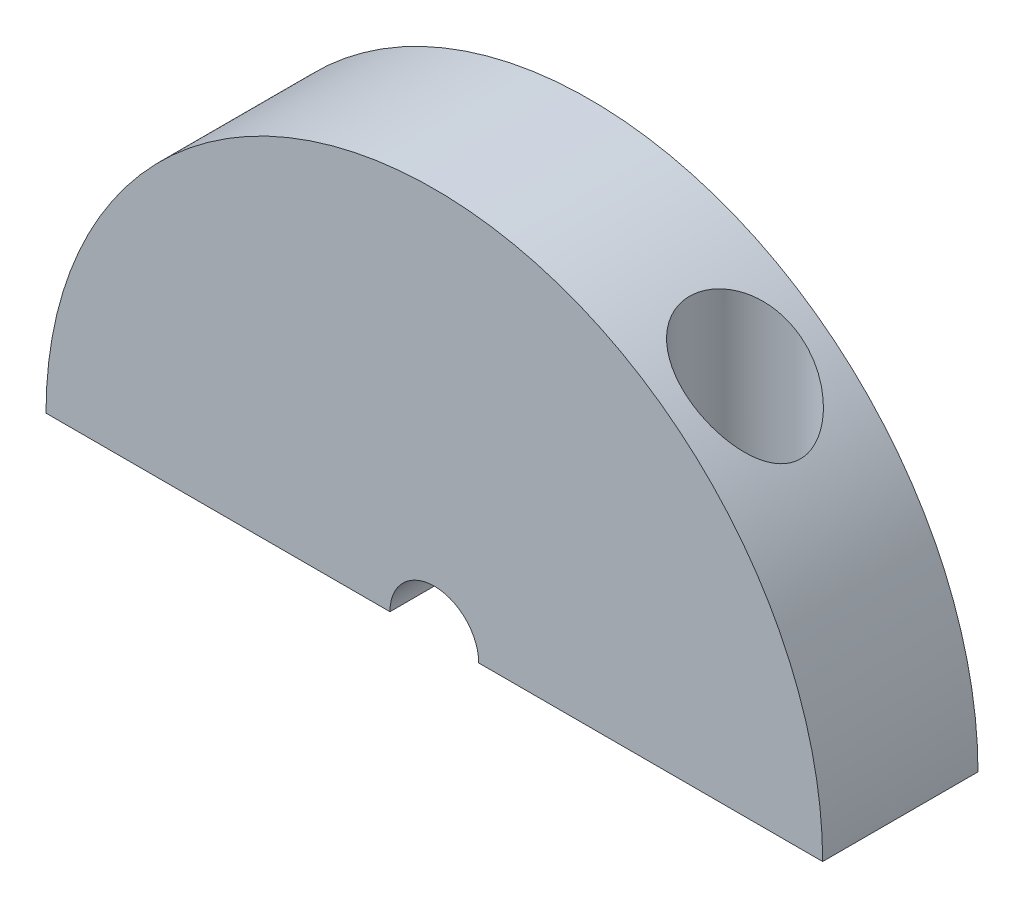
ISO-10303-21;
HEADER;
FILE_DESCRIPTION(('STEP AP214'),'2;1');
FILE_NAME('part.step','',(''),(''),'','','');
FILE_SCHEMA(('AUTOMOTIVE_DESIGN { 1 0 10303 214 1 1 1 1 }'));
ENDSEC;
DATA;
#1=APPLICATION_CONTEXT('core data for automotive mechanical design processes');
#2=APPLICATION_PROTOCOL_DEFINITION('international standard','automotive_design',2000,#1);
#3=PRODUCT_CONTEXT('',#1,'mechanical');
#4=PRODUCT('Part','Part','',(#3));
#5=PRODUCT_RELATED_PRODUCT_CATEGORY('part','',(#4));
#6=PRODUCT_DEFINITION_FORMATION('','',#4);
#7=PRODUCT_DEFINITION_CONTEXT('part definition',#1,'design');
#8=PRODUCT_DEFINITION('design','',#6,#7);
#9=PRODUCT_DEFINITION_SHAPE('','',#8);
#10=(LENGTH_UNIT() NAMED_UNIT(*) SI_UNIT(.MILLI.,.METRE.));
#11=(NAMED_UNIT(*) PLANE_ANGLE_UNIT() SI_UNIT($,.RADIAN.));
#12=(NAMED_UNIT(*) SI_UNIT($,.STERADIAN.) SOLID_ANGLE_UNIT());
#13=UNCERTAINTY_MEASURE_WITH_UNIT(LENGTH_MEASURE(1.E-05),#10,'distance_accuracy_value','');
#14=(GEOMETRIC_REPRESENTATION_CONTEXT(3) GLOBAL_UNCERTAINTY_ASSIGNED_CONTEXT((#13)) GLOBAL_UNIT_ASSIGNED_CONTEXT((#10,
#11,#12)) REPRESENTATION_CONTEXT('',''));
#15=CARTESIAN_POINT('',(0.,0.,0.));
#16=DIRECTION('',(0.,0.,1.));
#17=DIRECTION('',(1.,0.,0.));
#18=AXIS2_PLACEMENT_3D('',#15,#16,#17);
#19=CARTESIAN_POINT('',(0.,0.,5.));
#20=DIRECTION('',(0.,1.,0.));
#21=DIRECTION('',(0.,0.,1.));
#22=AXIS2_PLACEMENT_3D('',#19,#20,#21);
#23=PLANE('',#22);
#24=CARTESIAN_POINT('',(10.5,0.,1.5));
#25=DIRECTION('',(0.,-1.,0.));
#26=DIRECTION('',(0.,0.,-1.));
#27=AXIS2_PLACEMENT_3D('',#24,#25,#26);
#28=CIRCLE('',#27,2.5);
#29=CARTESIAN_POINT('',(10.5,0.,-1.));
#30=VERTEX_POINT('',#29);
#31=EDGE_CURVE('E115',#30,#30,#28,.T.);
#32=ORIENTED_EDGE('',*,*,#31,.F.);
#33=EDGE_LOOP('',(#32));
#34=FACE_BOUND('',#33,.T.);
#35=DIRECTION('',(0.,0.,-1.));
#36=VECTOR('',#35,1.);
#37=CARTESIAN_POINT('',(2.,0.,5.));
#38=LINE('',#37,#36);
#39=CARTESIAN_POINT('',(2.,0.,5.));
#40=VERTEX_POINT('',#39);
#41=CARTESIAN_POINT('',(2.,0.,-2.));
#42=VERTEX_POINT('',#41);
#43=EDGE_CURVE('E91',#40,#42,#38,.T.);
#44=ORIENTED_EDGE('',*,*,#43,.T.);
#45=DIRECTION('',(-1.,0.,0.));
#46=VECTOR('',#45,1.);
#47=CARTESIAN_POINT('',(0.,0.,-2.));
#48=LINE('',#47,#46);
#49=CARTESIAN_POINT('',(17.5,0.,-2.));
#50=VERTEX_POINT('',#49);
#51=EDGE_CURVE('E106',#50,#42,#48,.T.);
#52=ORIENTED_EDGE('',*,*,#51,.F.);
#53=DIRECTION('',(0.,0.,-1.));
#54=VECTOR('',#53,1.);
#55=CARTESIAN_POINT('',(17.5,0.,5.));
#56=LINE('',#55,#54);
#57=CARTESIAN_POINT('',(17.5,0.,5.));
#58=VERTEX_POINT('',#57);
#59=EDGE_CURVE('E11',#58,#50,#56,.T.);
#60=ORIENTED_EDGE('',*,*,#59,.F.);
#61=DIRECTION('',(1.,0.,0.));
#62=VECTOR('',#61,1.);
#63=CARTESIAN_POINT('',(0.,0.,5.));
#64=LINE('',#63,#62);
#65=EDGE_CURVE('E122',#40,#58,#64,.T.);
#66=ORIENTED_EDGE('',*,*,#65,.F.);
#67=EDGE_LOOP('',(#44,#52,#60,#66));
#68=FACE_BOUND('',#67,.T.);
#69=ADVANCED_FACE('F41',(#34,#68),#23,.F.);
#70=CARTESIAN_POINT('',(0.,0.,5.));
#71=DIRECTION('',(0.,0.,-1.));
#72=DIRECTION('',(-1.,0.,0.));
#73=AXIS2_PLACEMENT_3D('',#70,#71,#72);
#74=CYLINDRICAL_SURFACE('',#73,17.5);
#75=CARTESIAN_POINT('',(10.5,14.,-1.));
#76=CARTESIAN_POINT('',(10.6693230555787,13.8730035055793,-1.0000016352744));
#77=CARTESIAN_POINT('',(10.8363611731034,13.7428890883798,-0.982820948631325));
#78=CARTESIAN_POINT('',(11.1620383708418,13.4797194890011,-0.916484977652637));
#79=CARTESIAN_POINT('',(11.3206602227136,13.3466590093686,-0.867266650338043));
#80=CARTESIAN_POINT('',(11.5545008539908,13.1436366315808,-0.768438454367837));
#81=CARTESIAN_POINT('',(11.6340869679816,13.0732155909724,-0.72973697400391));
#82=CARTESIAN_POINT('',(11.7894012894902,12.933325852313,-0.643671841407805));
#83=CARTESIAN_POINT('',(11.8651285961072,12.8638573793963,-0.59630617812158));
#84=CARTESIAN_POINT('',(12.0120203035548,12.7268002995096,-0.492949771699154));
#85=CARTESIAN_POINT('',(12.0831915342044,12.6592089690166,-0.436972388149344));
#86=CARTESIAN_POINT('',(12.22038889146,12.5268184766452,-0.316207114074774));
#87=CARTESIAN_POINT('',(12.2864179487222,12.4620177338944,-0.251424300654024));
#88=CARTESIAN_POINT('',(12.4290195843983,12.3199852665967,-0.094637242040607));
#89=CARTESIAN_POINT('',(12.5038462643344,12.2439231612622,5.87841243523138E-05));
#90=CARTESIAN_POINT('',(12.6415773251657,12.1016651981894,0.204326186316351));
#91=CARTESIAN_POINT('',(12.7045022298258,12.0354523989296,0.313871385349282));
#92=CARTESIAN_POINT('',(12.8028601001329,11.9306647299672,0.521755813628883));
#93=CARTESIAN_POINT('',(12.8412953051854,11.889216553179,0.61720383534389));
#94=CARTESIAN_POINT('',(12.9068972896313,11.8179675498429,0.816058430703008));
#95=CARTESIAN_POINT('',(12.9340732397431,11.7881572453378,0.919458445690622));
#96=CARTESIAN_POINT('',(12.9753233488609,11.7427409325516,1.13300490566541));
#97=CARTESIAN_POINT('',(12.9892744484606,11.7272683685451,1.24320474532851));
#98=CARTESIAN_POINT('',(13.0022349070161,11.7128988961006,1.46553180838855));
#99=CARTESIAN_POINT('',(13.0012555614562,11.7139894569879,1.57765751064734));
#100=CARTESIAN_POINT('',(12.9856894682484,11.7312382462987,1.78374398965684));
#101=CARTESIAN_POINT('',(12.9730303946788,11.7452618137948,1.87804690429587));
#102=CARTESIAN_POINT('',(12.9377233255306,11.7841419536152,2.06243058588766));
#103=CARTESIAN_POINT('',(12.9150703198579,11.8090039593219,2.15250921005719));
#104=CARTESIAN_POINT('',(12.8521484906218,11.877502612602,2.35564533238325));
#105=CARTESIAN_POINT('',(12.8085338482652,11.9246269854825,2.46648297337034));
#106=CARTESIAN_POINT('',(12.7090073410929,12.0306457476111,2.67637069429108));
#107=CARTESIAN_POINT('',(12.6530704688397,12.0895640496048,2.77539616269664));
#108=CARTESIAN_POINT('',(12.5070994711457,12.2408081513281,2.9985831345722));
#109=CARTESIAN_POINT('',(12.412370584185,12.3370774481468,3.11698427561115));
#110=CARTESIAN_POINT('',(12.2084608858717,12.5389081240049,3.33114269562967));
#111=CARTESIAN_POINT('',(12.099256101501,12.6444848173778,3.4268616620831));
#112=CARTESIAN_POINT('',(11.8392187730149,12.8888477518641,3.61872399469626));
#113=CARTESIAN_POINT('',(11.6849753455386,13.0290886288363,3.70841013720879));
#114=CARTESIAN_POINT('',(11.3624566809274,13.3112962792632,3.85317095796061));
#115=CARTESIAN_POINT('',(11.194173136429,13.4532640314458,3.90822497792837));
#116=CARTESIAN_POINT('',(10.8466776827386,13.734985194969,3.98223820455316));
#117=CARTESIAN_POINT('',(10.6674198319007,13.8747257031516,4.00103320191378));
#118=CARTESIAN_POINT('',(10.3037362611311,14.1468840450346,3.99888363343784));
#119=CARTESIAN_POINT('',(10.1193194088438,14.2793134049036,3.97800357064157));
#120=CARTESIAN_POINT('',(9.79586048819215,14.5024217222146,3.90309620768234));
#121=CARTESIAN_POINT('',(9.65640879200539,14.5955642533284,3.85808293888247));
#122=CARTESIAN_POINT('',(9.3827942713,14.7729349731376,3.74140349200461));
#123=CARTESIAN_POINT('',(9.2486296157144,14.8571662654054,3.66974663276828));
#124=CARTESIAN_POINT('',(9.05517145441867,14.9753039674369,3.54170207717697));
#125=CARTESIAN_POINT('',(8.99170753460297,15.0134726587736,3.49533029910775));
#126=CARTESIAN_POINT('',(8.86838866581365,15.0866430177279,3.39581402359019));
#127=CARTESIAN_POINT('',(8.80853176753403,15.1216464011553,3.34267323349027));
#128=CARTESIAN_POINT('',(8.69328200991433,15.1881954739684,3.22981793581624));
#129=CARTESIAN_POINT('',(8.63788767014231,15.2197423113073,3.17010562399612));
#130=CARTESIAN_POINT('',(8.53243806534632,15.2791087184906,3.04448533342454));
#131=CARTESIAN_POINT('',(8.48238172357917,15.3069290403125,2.9785786092314));
#132=CARTESIAN_POINT('',(8.35487150028068,15.3770793104241,2.79180568055902));
#133=CARTESIAN_POINT('',(8.28336740973211,15.4155903838016,2.66529127360303));
#134=CARTESIAN_POINT('',(8.16272196563949,15.4798161378617,2.39914521986531));
#135=CARTESIAN_POINT('',(8.11356161528239,15.505541690635,2.25952483821126));
#136=CARTESIAN_POINT('',(8.04476539851738,15.5413340530648,1.98887300806376));
#137=CARTESIAN_POINT('',(8.02235606697431,15.5528765299304,1.8587373423943));
#138=CARTESIAN_POINT('',(7.99837250123543,15.5652252149785,1.59607692934752));
#139=CARTESIAN_POINT('',(7.99679024998357,15.5660355543289,1.46355312092032));
#140=CARTESIAN_POINT('',(8.01409006711534,15.5571344871716,1.20671292928975));
#141=CARTESIAN_POINT('',(8.0319826940875,15.5479318102167,1.08231036252547));
#142=CARTESIAN_POINT('',(8.0858455484668,15.5199875406474,0.838616455989379));
#143=CARTESIAN_POINT('',(8.12181488551679,15.5012464178427,0.719324864793665));
#144=CARTESIAN_POINT('',(8.21061608098594,15.4543944022805,0.487967544306255));
#145=CARTESIAN_POINT('',(8.26359026263401,15.4262043346226,0.375972760721606));
#146=CARTESIAN_POINT('',(8.38406428870482,15.3610592326632,0.162911821541665));
#147=CARTESIAN_POINT('',(8.45156663676333,15.3241026875243,0.0618475541159043));
#148=CARTESIAN_POINT('',(8.60285907918463,15.2397090096064,-0.133084048930238));
#149=CARTESIAN_POINT('',(8.68737619476909,15.191781417769,-0.226172613667525));
#150=CARTESIAN_POINT('',(8.86661120947417,15.0878739009523,-0.39667118723182));
#151=CARTESIAN_POINT('',(8.96133309772896,15.031890824123,-0.474075030453931));
#152=CARTESIAN_POINT('',(9.16861022593447,14.9064675800351,-0.620182466926158));
#153=CARTESIAN_POINT('',(9.28198519990648,14.836226319729,-0.687029977594648));
#154=CARTESIAN_POINT('',(9.51385755929162,14.6886156779839,-0.800919540383731));
#155=CARTESIAN_POINT('',(9.6323567083407,14.6112438318104,-0.847954712706855));
#156=CARTESIAN_POINT('',(9.87605965365903,14.4476914685871,-0.924382413746074));
#157=CARTESIAN_POINT('',(10.0013457611372,14.3612863001601,-0.953024473289765));
#158=CARTESIAN_POINT('',(10.2514941329313,14.1838091849957,-0.990835535306657));
#159=CARTESIAN_POINT('',(10.3763562616972,14.0927358726658,-0.999998805883587));
#160=CARTESIAN_POINT('',(10.5,14.,-1.));
#161=B_SPLINE_CURVE_WITH_KNOTS('',3,(#75,#76,#77,#78,#79,#80,#81,#82,#83,#84,#85,#86,#87,#88,
#89,#90,#91,#92,#93,#94,#95,#96,#97,#98,#99,#100,#101,#102,#103,#104,#105,#106,#107,#108,#109,
#110,#111,#112,#113,#114,#115,#116,#117,#118,#119,#120,#121,#122,#123,#124,#125,#126,#127,#128,
#129,#130,#131,#132,#133,#134,#135,#136,#137,#138,#139,#140,#141,#142,#143,#144,#145,#146,#147,
#148,#149,#150,#151,#152,#153,#154,#155,#156,#157,#158,#159,#160),.UNSPECIFIED.,.T.,.F.,(4,2,2,
2,2,2,2,2,2,2,2,2,2,2,2,2,2,2,2,2,2,2,2,2,2,2,2,2,2,2,2,2,2,2,2,2,2,2,2,2,2,2,4),(0.,
0.634472384308315,1.27019705942767,1.60915402886446,1.94818977407963,2.28670477144107,
2.62502540665639,3.05164478737499,3.47752164881237,3.80908052640154,4.14036881421213,
4.47471037956528,4.80879901459162,5.09603238886687,5.38340992105232,5.76556940901357,
6.14851173805806,6.68442334560445,7.22123381150525,7.89866577359558,8.57650144573758,
9.25739974892904,9.93719200627522,10.4561053146142,10.9748372986986,11.2366438990374,
11.4983077210505,11.7598843768096,12.0214081689733,12.4696190755632,12.9174481937973,
13.3130784667791,13.7085564436723,14.0848412038336,14.4611074321386,14.8406087586791,
15.220175537041,15.6221833150365,16.0243488155152,16.4701632788945,16.9161324231465,
17.379303032847,17.8426099178878),.UNSPECIFIED.);
#162=CARTESIAN_POINT('',(10.5,14.,-1.));
#163=VERTEX_POINT('',#162);
#164=EDGE_CURVE('E44',#163,#163,#161,.T.);
#165=ORIENTED_EDGE('',*,*,#164,.T.);
#166=EDGE_LOOP('',(#165));
#167=FACE_BOUND('',#166,.T.);
#168=ORIENTED_EDGE('',*,*,#59,.T.);
#169=CARTESIAN_POINT('',(0.,0.,-2.));
#170=DIRECTION('',(0.,0.,-1.));
#171=DIRECTION('',(-1.,0.,0.));
#172=AXIS2_PLACEMENT_3D('',#169,#170,#171);
#173=CIRCLE('',#172,17.5);
#174=CARTESIAN_POINT('',(-17.5,0.,-2.));
#175=VERTEX_POINT('',#174);
#176=EDGE_CURVE('E101',#175,#50,#173,.T.);
#177=ORIENTED_EDGE('',*,*,#176,.F.);
#178=DIRECTION('',(0.,0.,-1.));
#179=VECTOR('',#178,1.);
#180=CARTESIAN_POINT('',(-17.5,0.,5.));
#181=LINE('',#180,#179);
#182=CARTESIAN_POINT('',(-17.5,0.,5.));
#183=VERTEX_POINT('',#182);
#184=EDGE_CURVE('E54',#183,#175,#181,.T.);
#185=ORIENTED_EDGE('',*,*,#184,.F.);
#186=CARTESIAN_POINT('',(0.,0.,5.));
#187=DIRECTION('',(0.,0.,1.));
#188=DIRECTION('',(1.,0.,0.));
#189=AXIS2_PLACEMENT_3D('',#186,#187,#188);
#190=CIRCLE('',#189,17.5);
#191=EDGE_CURVE('E125',#58,#183,#190,.T.);
#192=ORIENTED_EDGE('',*,*,#191,.F.);
#193=EDGE_LOOP('',(#168,#177,#185,#192));
#194=FACE_BOUND('',#193,.T.);
#195=ADVANCED_FACE('F141',(#167,#194),#74,.T.);
#196=CARTESIAN_POINT('',(0.,0.,5.));
#197=DIRECTION('',(0.,-1.,0.));
#198=DIRECTION('',(0.,0.,-1.));
#199=AXIS2_PLACEMENT_3D('',#196,#197,#198);
#200=PLANE('',#199);
#201=CARTESIAN_POINT('',(-10.5,0.,1.5));
#202=DIRECTION('',(0.,-1.,0.));
#203=DIRECTION('',(0.,0.,-1.));
#204=AXIS2_PLACEMENT_3D('',#201,#202,#203);
#205=CIRCLE('',#204,0.500000000000001);
#206=CARTESIAN_POINT('',(-10.5,0.,0.999999999999999));
#207=VERTEX_POINT('',#206);
#208=EDGE_CURVE('E112',#207,#207,#205,.T.);
#209=ORIENTED_EDGE('',*,*,#208,.F.);
#210=EDGE_LOOP('',(#209));
#211=FACE_BOUND('',#210,.T.);
#212=ORIENTED_EDGE('',*,*,#184,.T.);
#213=DIRECTION('',(-1.,0.,0.));
#214=VECTOR('',#213,1.);
#215=CARTESIAN_POINT('',(0.,0.,-2.));
#216=LINE('',#215,#214);
#217=CARTESIAN_POINT('',(-2.,0.,-2.));
#218=VERTEX_POINT('',#217);
#219=EDGE_CURVE('E94',#218,#175,#216,.T.);
#220=ORIENTED_EDGE('',*,*,#219,.F.);
#221=DIRECTION('',(0.,0.,-1.));
#222=VECTOR('',#221,1.);
#223=CARTESIAN_POINT('',(-2.,0.,5.));
#224=LINE('',#223,#222);
#225=CARTESIAN_POINT('',(-2.,0.,5.));
#226=VERTEX_POINT('',#225);
#227=EDGE_CURVE('E69',#226,#218,#224,.T.);
#228=ORIENTED_EDGE('',*,*,#227,.F.);
#229=DIRECTION('',(-1.,0.,0.));
#230=VECTOR('',#229,1.);
#231=CARTESIAN_POINT('',(0.,0.,5.));
#232=LINE('',#231,#230);
#233=EDGE_CURVE('E128',#226,#183,#232,.T.);
#234=ORIENTED_EDGE('',*,*,#233,.T.);
#235=EDGE_LOOP('',(#212,#220,#228,#234));
#236=FACE_BOUND('',#235,.T.);
#237=ADVANCED_FACE('F95',(#211,#236),#200,.T.);
#238=CARTESIAN_POINT('',(0.,0.,5.));
#239=DIRECTION('',(0.,0.,-1.));
#240=DIRECTION('',(-1.,0.,0.));
#241=AXIS2_PLACEMENT_3D('',#238,#239,#240);
#242=CYLINDRICAL_SURFACE('',#241,2.);
#243=ORIENTED_EDGE('',*,*,#43,.F.);
#244=CARTESIAN_POINT('',(0.,0.,5.));
#245=DIRECTION('',(0.,0.,1.));
#246=DIRECTION('',(1.,0.,0.));
#247=AXIS2_PLACEMENT_3D('',#244,#245,#246);
#248=CIRCLE('',#247,2.);
#249=EDGE_CURVE('E61',#40,#226,#248,.T.);
#250=ORIENTED_EDGE('',*,*,#249,.T.);
#251=ORIENTED_EDGE('',*,*,#227,.T.);
#252=CARTESIAN_POINT('',(0.,0.,-2.));
#253=DIRECTION('',(0.,0.,-1.));
#254=DIRECTION('',(-1.,0.,0.));
#255=AXIS2_PLACEMENT_3D('',#252,#253,#254);
#256=CIRCLE('',#255,2.);
#257=EDGE_CURVE('E89',#218,#42,#256,.T.);
#258=ORIENTED_EDGE('',*,*,#257,.T.);
#259=EDGE_LOOP('',(#243,#250,#251,#258));
#260=FACE_BOUND('',#259,.T.);
#261=ADVANCED_FACE('F87',(#260),#242,.F.);
#262=CARTESIAN_POINT('',(0.,0.,5.));
#263=DIRECTION('',(0.,0.,1.));
#264=DIRECTION('',(1.,0.,0.));
#265=AXIS2_PLACEMENT_3D('',#262,#263,#264);
#266=PLANE('',#265);
#267=ORIENTED_EDGE('',*,*,#249,.F.);
#268=ORIENTED_EDGE('',*,*,#65,.T.);
#269=ORIENTED_EDGE('',*,*,#191,.T.);
#270=ORIENTED_EDGE('',*,*,#233,.F.);
#271=EDGE_LOOP('',(#267,#268,#269,#270));
#272=FACE_BOUND('',#271,.T.);
#273=ADVANCED_FACE('F139',(#272),#266,.T.);
#274=CARTESIAN_POINT('',(0.,0.,-2.));
#275=DIRECTION('',(0.,0.,-1.));
#276=DIRECTION('',(-1.,0.,0.));
#277=AXIS2_PLACEMENT_3D('',#274,#275,#276);
#278=PLANE('',#277);
#279=ORIENTED_EDGE('',*,*,#257,.F.);
#280=ORIENTED_EDGE('',*,*,#219,.T.);
#281=ORIENTED_EDGE('',*,*,#176,.T.);
#282=ORIENTED_EDGE('',*,*,#51,.T.);
#283=EDGE_LOOP('',(#279,#280,#281,#282));
#284=FACE_BOUND('',#283,.T.);
#285=ADVANCED_FACE('F104',(#284),#278,.T.);
#286=CARTESIAN_POINT('',(-10.5,2.,1.5));
#287=DIRECTION('',(0.,-1.,0.));
#288=DIRECTION('',(0.,0.,-1.));
#289=AXIS2_PLACEMENT_3D('',#286,#287,#288);
#290=CYLINDRICAL_SURFACE('',#289,0.500000000000001);
#291=CARTESIAN_POINT('',(-10.5,2.,1.5));
#292=DIRECTION('',(0.,-1.,0.));
#293=DIRECTION('',(0.,0.,-1.));
#294=AXIS2_PLACEMENT_3D('',#291,#292,#293);
#295=CIRCLE('',#294,0.500000000000001);
#296=CARTESIAN_POINT('',(-10.5,2.,0.999999999999999));
#297=VERTEX_POINT('',#296);
#298=EDGE_CURVE('E108',#297,#297,#295,.T.);
#299=ORIENTED_EDGE('',*,*,#298,.F.);
#300=EDGE_LOOP('',(#299));
#301=FACE_BOUND('',#300,.T.);
#302=ORIENTED_EDGE('',*,*,#208,.T.);
#303=EDGE_LOOP('',(#302));
#304=FACE_BOUND('',#303,.T.);
#305=ADVANCED_FACE('F160',(#301,#304),#290,.F.);
#306=CARTESIAN_POINT('',(-10.5,2.,1.5));
#307=DIRECTION('',(0.,-1.,0.));
#308=DIRECTION('',(0.,0.,-1.));
#309=AXIS2_PLACEMENT_3D('',#306,#307,#308);
#310=PLANE('',#309);
#311=ORIENTED_EDGE('',*,*,#298,.T.);
#312=EDGE_LOOP('',(#311));
#313=FACE_BOUND('',#312,.T.);
#314=ADVANCED_FACE('F164',(#313),#310,.T.);
#315=CARTESIAN_POINT('',(10.5,2.,1.5));
#316=DIRECTION('',(0.,-1.,0.));
#317=DIRECTION('',(0.,0.,-1.));
#318=AXIS2_PLACEMENT_3D('',#315,#316,#317);
#319=CYLINDRICAL_SURFACE('',#318,2.5);
#320=ORIENTED_EDGE('',*,*,#31,.T.);
#321=EDGE_LOOP('',(#320));
#322=FACE_BOUND('',#321,.T.);
#323=ORIENTED_EDGE('',*,*,#164,.F.);
#324=EDGE_LOOP('',(#323));
#325=FACE_BOUND('',#324,.T.);
#326=ADVANCED_FACE('F161',(#322,#325),#319,.F.);
#327=CLOSED_SHELL('',(#69,#195,#237,#261,#273,#285,#305,#314,#326));
#328=MANIFOLD_SOLID_BREP('B2',#327);
#329=ADVANCED_BREP_SHAPE_REPRESENTATION('',(#18,#328),#14);
#330=SHAPE_DEFINITION_REPRESENTATION(#9,#329);
ENDSEC;
END-ISO-10303-21;
